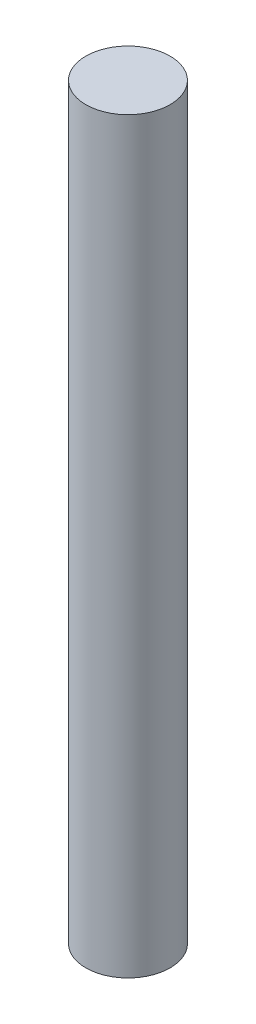
ISO-10303-21;
HEADER;
FILE_DESCRIPTION(('STEP AP214'),'2;1');
FILE_NAME('part.step','',(''),(''),'','','');
FILE_SCHEMA(('AUTOMOTIVE_DESIGN { 1 0 10303 214 1 1 1 1 }'));
ENDSEC;
DATA;
#1=APPLICATION_CONTEXT('core data for automotive mechanical design processes');
#2=APPLICATION_PROTOCOL_DEFINITION('international standard','automotive_design',2000,#1);
#3=PRODUCT_CONTEXT('',#1,'mechanical');
#4=PRODUCT('Part','Part','',(#3));
#5=PRODUCT_RELATED_PRODUCT_CATEGORY('part','',(#4));
#6=PRODUCT_DEFINITION_FORMATION('','',#4);
#7=PRODUCT_DEFINITION_CONTEXT('part definition',#1,'design');
#8=PRODUCT_DEFINITION('design','',#6,#7);
#9=PRODUCT_DEFINITION_SHAPE('','',#8);
#10=(LENGTH_UNIT() NAMED_UNIT(*) SI_UNIT(.MILLI.,.METRE.));
#11=(NAMED_UNIT(*) PLANE_ANGLE_UNIT() SI_UNIT($,.RADIAN.));
#12=(NAMED_UNIT(*) SI_UNIT($,.STERADIAN.) SOLID_ANGLE_UNIT());
#13=UNCERTAINTY_MEASURE_WITH_UNIT(LENGTH_MEASURE(1.E-05),#10,'distance_accuracy_value','');
#14=(GEOMETRIC_REPRESENTATION_CONTEXT(3) GLOBAL_UNCERTAINTY_ASSIGNED_CONTEXT((#13)) GLOBAL_UNIT_ASSIGNED_CONTEXT((#10,
#11,#12)) REPRESENTATION_CONTEXT('',''));
#15=CARTESIAN_POINT('',(0.,0.,0.));
#16=DIRECTION('',(0.,0.,1.));
#17=DIRECTION('',(1.,0.,0.));
#18=AXIS2_PLACEMENT_3D('',#15,#16,#17);
#19=CARTESIAN_POINT('',(0.,665.48,0.));
#20=DIRECTION('',(0.,-1.,0.));
#21=DIRECTION('',(0.,0.,-1.));
#22=AXIS2_PLACEMENT_3D('',#19,#20,#21);
#23=CYLINDRICAL_SURFACE('',#22,37.465);
#24=CARTESIAN_POINT('',(0.,665.48,0.));
#25=DIRECTION('',(0.,1.,0.));
#26=DIRECTION('',(0.,0.,1.));
#27=AXIS2_PLACEMENT_3D('',#24,#25,#26);
#28=CIRCLE('',#27,37.465);
#29=CARTESIAN_POINT('',(0.,665.48,37.465));
#30=VERTEX_POINT('',#29);
#31=EDGE_CURVE('E10',#30,#30,#28,.T.);
#32=ORIENTED_EDGE('',*,*,#31,.F.);
#33=EDGE_LOOP('',(#32));
#34=FACE_BOUND('',#33,.T.);
#35=CARTESIAN_POINT('',(0.,0.,0.));
#36=DIRECTION('',(0.,1.,0.));
#37=DIRECTION('',(0.,0.,1.));
#38=AXIS2_PLACEMENT_3D('',#35,#36,#37);
#39=CIRCLE('',#38,37.465);
#40=CARTESIAN_POINT('',(0.,0.,37.465));
#41=VERTEX_POINT('',#40);
#42=EDGE_CURVE('E38',#41,#41,#39,.T.);
#43=ORIENTED_EDGE('',*,*,#42,.T.);
#44=EDGE_LOOP('',(#43));
#45=FACE_BOUND('',#44,.T.);
#46=ADVANCED_FACE('F35',(#34,#45),#23,.T.);
#47=CARTESIAN_POINT('',(0.,665.48,0.));
#48=DIRECTION('',(0.,1.,0.));
#49=DIRECTION('',(0.,0.,1.));
#50=AXIS2_PLACEMENT_3D('',#47,#48,#49);
#51=PLANE('',#50);
#52=ORIENTED_EDGE('',*,*,#31,.T.);
#53=EDGE_LOOP('',(#52));
#54=FACE_BOUND('',#53,.T.);
#55=ADVANCED_FACE('F50',(#54),#51,.T.);
#56=CARTESIAN_POINT('',(0.,0.,0.));
#57=DIRECTION('',(0.,1.,0.));
#58=DIRECTION('',(0.,0.,1.));
#59=AXIS2_PLACEMENT_3D('',#56,#57,#58);
#60=PLANE('',#59);
#61=ORIENTED_EDGE('',*,*,#42,.F.);
#62=EDGE_LOOP('',(#61));
#63=FACE_BOUND('',#62,.T.);
#64=ADVANCED_FACE('F48',(#63),#60,.F.);
#65=CLOSED_SHELL('',(#46,#55,#64));
#66=MANIFOLD_SOLID_BREP('B2',#65);
#67=ADVANCED_BREP_SHAPE_REPRESENTATION('',(#18,#66),#14);
#68=SHAPE_DEFINITION_REPRESENTATION(#9,#67);
ENDSEC;
END-ISO-10303-21;
